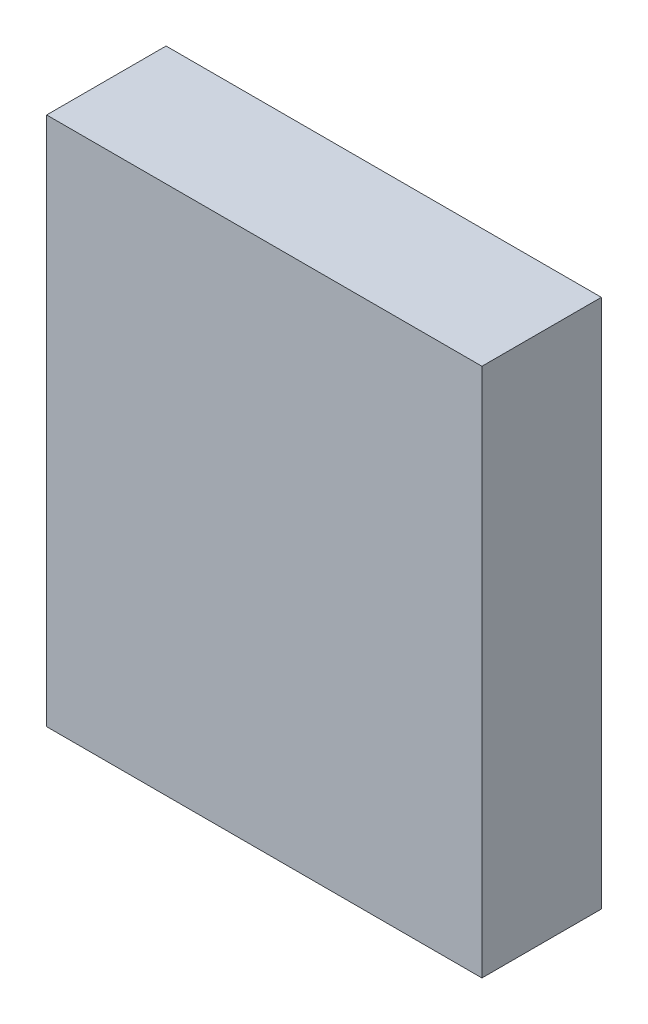
ISO-10303-21;
HEADER;
FILE_DESCRIPTION(('STEP AP214'),'2;1');
FILE_NAME('part.step','',(''),(''),'','','');
FILE_SCHEMA(('AUTOMOTIVE_DESIGN { 1 0 10303 214 1 1 1 1 }'));
ENDSEC;
DATA;
#1=APPLICATION_CONTEXT('core data for automotive mechanical design processes');
#2=APPLICATION_PROTOCOL_DEFINITION('international standard','automotive_design',2000,#1);
#3=PRODUCT_CONTEXT('',#1,'mechanical');
#4=PRODUCT('Part','Part','',(#3));
#5=PRODUCT_RELATED_PRODUCT_CATEGORY('part','',(#4));
#6=PRODUCT_DEFINITION_FORMATION('','',#4);
#7=PRODUCT_DEFINITION_CONTEXT('part definition',#1,'design');
#8=PRODUCT_DEFINITION('design','',#6,#7);
#9=PRODUCT_DEFINITION_SHAPE('','',#8);
#10=(LENGTH_UNIT() NAMED_UNIT(*) SI_UNIT(.MILLI.,.METRE.));
#11=(NAMED_UNIT(*) PLANE_ANGLE_UNIT() SI_UNIT($,.RADIAN.));
#12=(NAMED_UNIT(*) SI_UNIT($,.STERADIAN.) SOLID_ANGLE_UNIT());
#13=UNCERTAINTY_MEASURE_WITH_UNIT(LENGTH_MEASURE(1.E-05),#10,'distance_accuracy_value','');
#14=(GEOMETRIC_REPRESENTATION_CONTEXT(3) GLOBAL_UNCERTAINTY_ASSIGNED_CONTEXT((#13)) GLOBAL_UNIT_ASSIGNED_CONTEXT((#10,
#11,#12)) REPRESENTATION_CONTEXT('',''));
#15=CARTESIAN_POINT('',(0.,0.,0.));
#16=DIRECTION('',(0.,0.,1.));
#17=DIRECTION('',(1.,0.,0.));
#18=AXIS2_PLACEMENT_3D('',#15,#16,#17);
#19=CARTESIAN_POINT('',(-98.525,-32.56500453459,70.15816558701));
#20=DIRECTION('',(0.,0.,-1.));
#21=DIRECTION('',(-1.,0.,0.));
#22=AXIS2_PLACEMENT_3D('',#19,#20,#21);
#23=PLANE('',#22);
#24=DIRECTION('',(1.,0.,0.));
#25=VECTOR('',#24,1.);
#26=CARTESIAN_POINT('',(-98.525,-34.96876700471,70.15816558701));
#27=LINE('',#26,#25);
#28=CARTESIAN_POINT('',(-96.55,-34.96876700471,70.15816558701));
#29=VERTEX_POINT('',#28);
#30=CARTESIAN_POINT('',(-100.5,-34.96876700471,70.15816558701));
#31=VERTEX_POINT('',#30);
#32=EDGE_CURVE('E20',#29,#31,#27,.F.);
#33=ORIENTED_EDGE('',*,*,#32,.T.);
#34=DIRECTION('',(0.,1.,0.));
#35=VECTOR('',#34,1.);
#36=CARTESIAN_POINT('',(-100.5,-54.,70.15816558701));
#37=LINE('',#36,#35);
#38=CARTESIAN_POINT('',(-100.5,-30.1612420644695,70.15816558701));
#39=VERTEX_POINT('',#38);
#40=EDGE_CURVE('E80',#39,#31,#37,.F.);
#41=ORIENTED_EDGE('',*,*,#40,.F.);
#42=DIRECTION('',(-1.,4.641013312053E-13,0.));
#43=VECTOR('',#42,1.);
#44=CARTESIAN_POINT('',(-98.525,-30.16124206447,70.15816558701));
#45=LINE('',#44,#43);
#46=CARTESIAN_POINT('',(-96.55,-30.1612420644702,70.15816558701));
#47=VERTEX_POINT('',#46);
#48=EDGE_CURVE('E61',#47,#39,#45,.T.);
#49=ORIENTED_EDGE('',*,*,#48,.F.);
#50=DIRECTION('',(0.,1.,0.));
#51=VECTOR('',#50,1.);
#52=CARTESIAN_POINT('',(-96.55,-54.,70.15816558701));
#53=LINE('',#52,#51);
#54=EDGE_CURVE('E55',#47,#29,#53,.F.);
#55=ORIENTED_EDGE('',*,*,#54,.T.);
#56=EDGE_LOOP('',(#33,#41,#49,#55));
#57=FACE_BOUND('',#56,.T.);
#58=ADVANCED_FACE('F17',(#57),#23,.T.);
#59=CARTESIAN_POINT('',(-98.525,-34.96876700471,70.7));
#60=DIRECTION('',(0.,1.,0.));
#61=DIRECTION('',(0.,0.,1.));
#62=AXIS2_PLACEMENT_3D('',#59,#60,#61);
#63=PLANE('',#62);
#64=DIRECTION('',(0.,0.,1.));
#65=VECTOR('',#64,1.);
#66=CARTESIAN_POINT('',(-96.55,-34.96876700471,-68.8));
#67=LINE('',#66,#65);
#68=CARTESIAN_POINT('',(-96.55,-34.96876700471,71.24183441299));
#69=VERTEX_POINT('',#68);
#70=EDGE_CURVE('E63',#29,#69,#67,.T.);
#71=ORIENTED_EDGE('',*,*,#70,.T.);
#72=DIRECTION('',(1.,0.,0.));
#73=VECTOR('',#72,1.);
#74=CARTESIAN_POINT('',(-98.525,-34.96876700471,71.24183441299));
#75=LINE('',#74,#73);
#76=CARTESIAN_POINT('',(-100.5,-34.96876700471,71.24183441299));
#77=VERTEX_POINT('',#76);
#78=EDGE_CURVE('E83',#77,#69,#75,.T.);
#79=ORIENTED_EDGE('',*,*,#78,.F.);
#80=DIRECTION('',(0.,0.,1.));
#81=VECTOR('',#80,1.);
#82=CARTESIAN_POINT('',(-100.5,-34.96876700471,-68.8));
#83=LINE('',#82,#81);
#84=EDGE_CURVE('E68',#31,#77,#83,.T.);
#85=ORIENTED_EDGE('',*,*,#84,.F.);
#86=ORIENTED_EDGE('',*,*,#32,.F.);
#87=EDGE_LOOP('',(#71,#79,#85,#86));
#88=FACE_BOUND('',#87,.T.);
#89=ADVANCED_FACE('F65',(#88),#63,.F.);
#90=CARTESIAN_POINT('',(-96.55,-54.,-68.8));
#91=DIRECTION('',(-1.,0.,0.));
#92=DIRECTION('',(0.,0.,1.));
#93=AXIS2_PLACEMENT_3D('',#90,#91,#92);
#94=PLANE('',#93);
#95=ORIENTED_EDGE('',*,*,#54,.F.);
#96=DIRECTION('',(0.,0.,1.));
#97=VECTOR('',#96,1.);
#98=CARTESIAN_POINT('',(-96.55,-30.1612420644709,70.7));
#99=LINE('',#98,#97);
#100=CARTESIAN_POINT('',(-96.55,-30.1612420644702,71.24183441299));
#101=VERTEX_POINT('',#100);
#102=EDGE_CURVE('E74',#101,#47,#99,.F.);
#103=ORIENTED_EDGE('',*,*,#102,.F.);
#104=DIRECTION('',(0.,1.,0.));
#105=VECTOR('',#104,1.);
#106=CARTESIAN_POINT('',(-96.55,-32.56500453459,71.24183441299));
#107=LINE('',#106,#105);
#108=EDGE_CURVE('E72',#69,#101,#107,.T.);
#109=ORIENTED_EDGE('',*,*,#108,.F.);
#110=ORIENTED_EDGE('',*,*,#70,.F.);
#111=EDGE_LOOP('',(#95,#103,#109,#110));
#112=FACE_BOUND('',#111,.T.);
#113=ADVANCED_FACE('F70',(#112),#94,.F.);
#114=CARTESIAN_POINT('',(-98.525,-30.16124206447,70.7));
#115=DIRECTION('',(4.641013312053E-13,1.,0.));
#116=DIRECTION('',(-1.,4.641013312053E-13,0.));
#117=AXIS2_PLACEMENT_3D('',#114,#115,#116);
#118=PLANE('',#117);
#119=ORIENTED_EDGE('',*,*,#48,.T.);
#120=DIRECTION('',(0.,0.,1.));
#121=VECTOR('',#120,1.);
#122=CARTESIAN_POINT('',(-100.5,-30.16124206447,-68.8));
#123=LINE('',#122,#121);
#124=CARTESIAN_POINT('',(-100.5,-30.1612420644695,71.24183441299));
#125=VERTEX_POINT('',#124);
#126=EDGE_CURVE('E35',#125,#39,#123,.F.);
#127=ORIENTED_EDGE('',*,*,#126,.F.);
#128=DIRECTION('',(1.,0.,0.));
#129=VECTOR('',#128,1.);
#130=CARTESIAN_POINT('',(-98.525,-30.16124206447,71.24183441299));
#131=LINE('',#130,#129);
#132=EDGE_CURVE('E26',#101,#125,#131,.F.);
#133=ORIENTED_EDGE('',*,*,#132,.F.);
#134=ORIENTED_EDGE('',*,*,#102,.T.);
#135=EDGE_LOOP('',(#119,#127,#133,#134));
#136=FACE_BOUND('',#135,.T.);
#137=ADVANCED_FACE('F89',(#136),#118,.T.);
#138=CARTESIAN_POINT('',(-100.5,-54.,-68.8));
#139=DIRECTION('',(-1.,0.,0.));
#140=DIRECTION('',(0.,0.,1.));
#141=AXIS2_PLACEMENT_3D('',#138,#139,#140);
#142=PLANE('',#141);
#143=ORIENTED_EDGE('',*,*,#84,.T.);
#144=DIRECTION('',(0.,1.,0.));
#145=VECTOR('',#144,1.);
#146=CARTESIAN_POINT('',(-100.5,-32.56500453459,71.24183441299));
#147=LINE('',#146,#145);
#148=EDGE_CURVE('E11',#125,#77,#147,.F.);
#149=ORIENTED_EDGE('',*,*,#148,.F.);
#150=ORIENTED_EDGE('',*,*,#126,.T.);
#151=ORIENTED_EDGE('',*,*,#40,.T.);
#152=EDGE_LOOP('',(#143,#149,#150,#151));
#153=FACE_BOUND('',#152,.T.);
#154=ADVANCED_FACE('F91',(#153),#142,.T.);
#155=CARTESIAN_POINT('',(-98.525,-32.56500453459,71.24183441299));
#156=DIRECTION('',(0.,0.,1.));
#157=DIRECTION('',(1.,0.,0.));
#158=AXIS2_PLACEMENT_3D('',#155,#156,#157);
#159=PLANE('',#158);
#160=ORIENTED_EDGE('',*,*,#132,.T.);
#161=ORIENTED_EDGE('',*,*,#148,.T.);
#162=ORIENTED_EDGE('',*,*,#78,.T.);
#163=ORIENTED_EDGE('',*,*,#108,.T.);
#164=EDGE_LOOP('',(#160,#161,#162,#163));
#165=FACE_BOUND('',#164,.T.);
#166=ADVANCED_FACE('F88',(#165),#159,.T.);
#167=CLOSED_SHELL('',(#58,#89,#113,#137,#154,#166));
#168=MANIFOLD_SOLID_BREP('B1',#167);
#169=ADVANCED_BREP_SHAPE_REPRESENTATION('',(#18,#168),#14);
#170=SHAPE_DEFINITION_REPRESENTATION(#9,#169);
ENDSEC;
END-ISO-10303-21;
